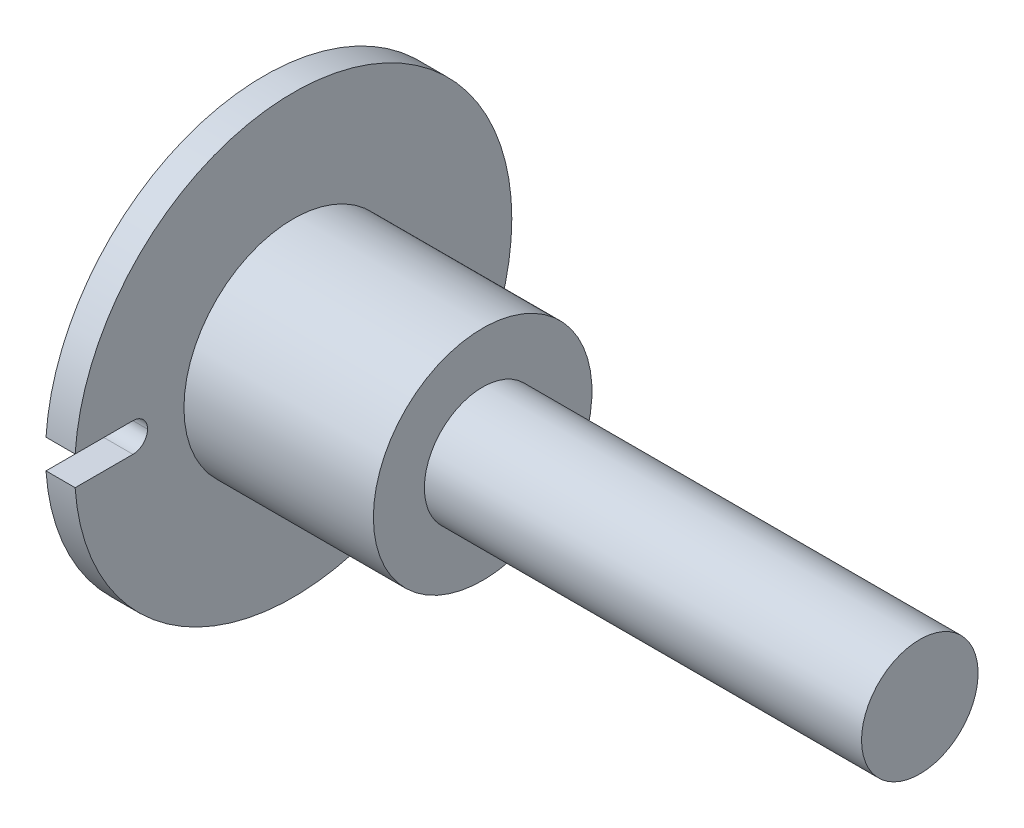
ISO-10303-21;
HEADER;
FILE_DESCRIPTION(('STEP AP214'),'2;1');
FILE_NAME('part.step','',(''),(''),'','','');
FILE_SCHEMA(('AUTOMOTIVE_DESIGN { 1 0 10303 214 1 1 1 1 }'));
ENDSEC;
DATA;
#1=APPLICATION_CONTEXT('core data for automotive mechanical design processes');
#2=APPLICATION_PROTOCOL_DEFINITION('international standard','automotive_design',2000,#1);
#3=PRODUCT_CONTEXT('',#1,'mechanical');
#4=PRODUCT('Part','Part','',(#3));
#5=PRODUCT_RELATED_PRODUCT_CATEGORY('part','',(#4));
#6=PRODUCT_DEFINITION_FORMATION('','',#4);
#7=PRODUCT_DEFINITION_CONTEXT('part definition',#1,'design');
#8=PRODUCT_DEFINITION('design','',#6,#7);
#9=PRODUCT_DEFINITION_SHAPE('','',#8);
#10=(LENGTH_UNIT() NAMED_UNIT(*) SI_UNIT(.MILLI.,.METRE.));
#11=(NAMED_UNIT(*) PLANE_ANGLE_UNIT() SI_UNIT($,.RADIAN.));
#12=(NAMED_UNIT(*) SI_UNIT($,.STERADIAN.) SOLID_ANGLE_UNIT());
#13=UNCERTAINTY_MEASURE_WITH_UNIT(LENGTH_MEASURE(1.E-05),#10,'distance_accuracy_value','');
#14=(GEOMETRIC_REPRESENTATION_CONTEXT(3) GLOBAL_UNCERTAINTY_ASSIGNED_CONTEXT((#13)) GLOBAL_UNIT_ASSIGNED_CONTEXT((#10,
#11,#12)) REPRESENTATION_CONTEXT('',''));
#15=CARTESIAN_POINT('',(0.,0.,0.));
#16=DIRECTION('',(0.,0.,1.));
#17=DIRECTION('',(1.,0.,0.));
#18=AXIS2_PLACEMENT_3D('',#15,#16,#17);
#19=CARTESIAN_POINT('',(0.,7.49999999999999,0.));
#20=DIRECTION('',(1.,0.,0.));
#21=DIRECTION('',(0.,0.,-1.));
#22=AXIS2_PLACEMENT_3D('',#19,#20,#21);
#23=PLANE('',#22);
#24=CARTESIAN_POINT('',(0.,0.,0.));
#25=DIRECTION('',(-1.,0.,0.));
#26=DIRECTION('',(0.,0.,1.));
#27=AXIS2_PLACEMENT_3D('',#24,#25,#26);
#28=CIRCLE('',#27,3.2);
#29=CARTESIAN_POINT('',(0.,0.,3.2));
#30=VERTEX_POINT('',#29);
#31=EDGE_CURVE('E350',#30,#30,#28,.T.);
#32=ORIENTED_EDGE('',*,*,#31,.F.);
#33=EDGE_LOOP('',(#32));
#34=FACE_BOUND('',#33,.T.);
#35=CARTESIAN_POINT('',(0.,0.,0.));
#36=DIRECTION('',(-1.,0.,0.));
#37=DIRECTION('',(0.,0.,1.));
#38=AXIS2_PLACEMENT_3D('',#35,#36,#37);
#39=CIRCLE('',#38,15.);
#40=CARTESIAN_POINT('',(0.,0.999999999999993,14.9666295470958));
#41=VERTEX_POINT('',#40);
#42=CARTESIAN_POINT('',(0.,-1.00000000000001,14.9666295470958));
#43=VERTEX_POINT('',#42);
#44=EDGE_CURVE('E115',#41,#43,#39,.T.);
#45=ORIENTED_EDGE('',*,*,#44,.T.);
#46=DIRECTION('',(0.,0.,1.));
#47=VECTOR('',#46,1.);
#48=CARTESIAN_POINT('',(0.,-1.00000000000001,15.8387925572259));
#49=LINE('',#48,#47);
#50=CARTESIAN_POINT('',(0.,-1.00000000000001,11.));
#51=VERTEX_POINT('',#50);
#52=EDGE_CURVE('E116',#51,#43,#49,.T.);
#53=ORIENTED_EDGE('',*,*,#52,.F.);
#54=CARTESIAN_POINT('',(0.,0.,11.));
#55=DIRECTION('',(1.,0.,0.));
#56=DIRECTION('',(0.,0.,-1.));
#57=AXIS2_PLACEMENT_3D('',#54,#55,#56);
#58=CIRCLE('',#57,1.);
#59=CARTESIAN_POINT('',(0.,0.,10.));
#60=VERTEX_POINT('',#59);
#61=EDGE_CURVE('E61',#51,#60,#58,.T.);
#62=ORIENTED_EDGE('',*,*,#61,.T.);
#63=CARTESIAN_POINT('',(0.,0.,11.));
#64=DIRECTION('',(1.,0.,0.));
#65=DIRECTION('',(0.,0.,-1.));
#66=AXIS2_PLACEMENT_3D('',#63,#64,#65);
#67=CIRCLE('',#66,1.);
#68=CARTESIAN_POINT('',(0.,0.999999999999993,11.));
#69=VERTEX_POINT('',#68);
#70=EDGE_CURVE('E48',#60,#69,#67,.T.);
#71=ORIENTED_EDGE('',*,*,#70,.T.);
#72=DIRECTION('',(0.,0.,-1.));
#73=VECTOR('',#72,1.);
#74=CARTESIAN_POINT('',(0.,0.999999999999993,15.8387925572259));
#75=LINE('',#74,#73);
#76=EDGE_CURVE('E104',#41,#69,#75,.T.);
#77=ORIENTED_EDGE('',*,*,#76,.F.);
#78=EDGE_LOOP('',(#45,#53,#62,#71,#77));
#79=FACE_BOUND('',#78,.T.);
#80=ADVANCED_FACE('F39',(#34,#79),#23,.F.);
#81=CARTESIAN_POINT('',(0.,0.,0.));
#82=DIRECTION('',(-1.,0.,0.));
#83=DIRECTION('',(0.,0.,1.));
#84=AXIS2_PLACEMENT_3D('',#81,#82,#83);
#85=CYLINDRICAL_SURFACE('',#84,15.);
#86=CARTESIAN_POINT('',(2.,0.,0.));
#87=DIRECTION('',(-1.,0.,0.));
#88=DIRECTION('',(0.,0.,1.));
#89=AXIS2_PLACEMENT_3D('',#86,#87,#88);
#90=CIRCLE('',#89,15.);
#91=CARTESIAN_POINT('',(2.,0.999999999999993,14.9666295470958));
#92=VERTEX_POINT('',#91);
#93=CARTESIAN_POINT('',(2.,-1.00000000000001,14.9666295470958));
#94=VERTEX_POINT('',#93);
#95=EDGE_CURVE('E122',#92,#94,#90,.T.);
#96=ORIENTED_EDGE('',*,*,#95,.T.);
#97=DIRECTION('',(-1.,0.,0.));
#98=VECTOR('',#97,1.);
#99=CARTESIAN_POINT('',(0.,-1.00000000000001,14.9666295470958));
#100=LINE('',#99,#98);
#101=EDGE_CURVE('E111',#94,#43,#100,.T.);
#102=ORIENTED_EDGE('',*,*,#101,.T.);
#103=ORIENTED_EDGE('',*,*,#44,.F.);
#104=DIRECTION('',(-1.,0.,0.));
#105=VECTOR('',#104,1.);
#106=CARTESIAN_POINT('',(0.,0.999999999999993,14.9666295470958));
#107=LINE('',#106,#105);
#108=EDGE_CURVE('E101',#41,#92,#107,.F.);
#109=ORIENTED_EDGE('',*,*,#108,.T.);
#110=EDGE_LOOP('',(#96,#102,#103,#109));
#111=FACE_BOUND('',#110,.T.);
#112=ADVANCED_FACE('F119',(#111),#85,.T.);
#113=CARTESIAN_POINT('',(2.,7.49999999999999,0.));
#114=DIRECTION('',(-1.,0.,0.));
#115=DIRECTION('',(0.,0.,1.));
#116=AXIS2_PLACEMENT_3D('',#113,#114,#115);
#117=PLANE('',#116);
#118=DIRECTION('',(0.,0.,-1.));
#119=VECTOR('',#118,1.);
#120=CARTESIAN_POINT('',(2.,0.999999999999991,0.));
#121=LINE('',#120,#119);
#122=CARTESIAN_POINT('',(2.,0.999999999999993,11.));
#123=VERTEX_POINT('',#122);
#124=EDGE_CURVE('E106',#92,#123,#121,.T.);
#125=ORIENTED_EDGE('',*,*,#124,.T.);
#126=CARTESIAN_POINT('',(2.,0.,11.));
#127=DIRECTION('',(-1.,0.,0.));
#128=DIRECTION('',(0.,0.,1.));
#129=AXIS2_PLACEMENT_3D('',#126,#127,#128);
#130=CIRCLE('',#129,1.);
#131=CARTESIAN_POINT('',(2.,0.,10.));
#132=VERTEX_POINT('',#131);
#133=EDGE_CURVE('E12',#123,#132,#130,.T.);
#134=ORIENTED_EDGE('',*,*,#133,.T.);
#135=CARTESIAN_POINT('',(2.,0.,11.));
#136=DIRECTION('',(-1.,0.,0.));
#137=DIRECTION('',(0.,0.,1.));
#138=AXIS2_PLACEMENT_3D('',#135,#136,#137);
#139=CIRCLE('',#138,1.);
#140=CARTESIAN_POINT('',(2.,-1.00000000000001,11.));
#141=VERTEX_POINT('',#140);
#142=EDGE_CURVE('E219',#132,#141,#139,.T.);
#143=ORIENTED_EDGE('',*,*,#142,.T.);
#144=DIRECTION('',(0.,0.,1.));
#145=VECTOR('',#144,1.);
#146=CARTESIAN_POINT('',(2.,-1.00000000000001,15.8387925572259));
#147=LINE('',#146,#145);
#148=EDGE_CURVE('E112',#141,#94,#147,.T.);
#149=ORIENTED_EDGE('',*,*,#148,.T.);
#150=ORIENTED_EDGE('',*,*,#95,.F.);
#151=EDGE_LOOP('',(#125,#134,#143,#149,#150));
#152=FACE_BOUND('',#151,.T.);
#153=CARTESIAN_POINT('',(2.,0.,0.));
#154=DIRECTION('',(-1.,0.,0.));
#155=DIRECTION('',(0.,0.,1.));
#156=AXIS2_PLACEMENT_3D('',#153,#154,#155);
#157=CIRCLE('',#156,7.49999999999999);
#158=CARTESIAN_POINT('',(2.,0.,7.49999999999999));
#159=VERTEX_POINT('',#158);
#160=EDGE_CURVE('E127',#159,#159,#157,.T.);
#161=ORIENTED_EDGE('',*,*,#160,.T.);
#162=EDGE_LOOP('',(#161));
#163=FACE_BOUND('',#162,.T.);
#164=ADVANCED_FACE('F197',(#152,#163),#117,.F.);
#165=CARTESIAN_POINT('',(0.,0.,0.));
#166=DIRECTION('',(-1.,0.,0.));
#167=DIRECTION('',(0.,0.,1.));
#168=AXIS2_PLACEMENT_3D('',#165,#166,#167);
#169=CYLINDRICAL_SURFACE('',#168,7.49999999999999);
#170=CARTESIAN_POINT('',(3.35000000000001,0.,-7.5));
#171=CARTESIAN_POINT('',(3.35000310611671,-0.0914999393408011,-7.49999831424107));
#172=CARTESIAN_POINT('',(3.35763681893135,-0.183037296855732,-7.49830854961463));
#173=CARTESIAN_POINT('',(3.38793774059132,-0.363511023320149,-7.49173097533342));
#174=CARTESIAN_POINT('',(3.41061560676644,-0.452445501715037,-7.48684089859969));
#175=CARTESIAN_POINT('',(3.4702594460308,-0.625079242768202,-7.47440705823353));
#176=CARTESIAN_POINT('',(3.5072104072657,-0.708783898837724,-7.46686608345357));
#177=CARTESIAN_POINT('',(3.59430369108382,-0.868802700314479,-7.4499439147352));
#178=CARTESIAN_POINT('',(3.64444570320342,-0.945117019602317,-7.44056276410836));
#179=CARTESIAN_POINT('',(3.75735851081085,-1.08942970934261,-7.42081741826452));
#180=CARTESIAN_POINT('',(3.82030233112952,-1.15729102940931,-7.41044091267737));
#181=CARTESIAN_POINT('',(3.95666059821246,-1.28158292851941,-7.38996090019821));
#182=CARTESIAN_POINT('',(4.03007598626926,-1.33801247885255,-7.37985741794559));
#183=CARTESIAN_POINT('',(4.18630865707019,-1.43844520787671,-7.36094592663126));
#184=CARTESIAN_POINT('',(4.2692219920339,-1.48230220287272,-7.35215368644802));
#185=CARTESIAN_POINT('',(4.4414672541749,-1.55540709540188,-7.33703697303093));
#186=CARTESIAN_POINT('',(4.53079840275644,-1.58465676165372,-7.33071220104563));
#187=CARTESIAN_POINT('',(4.71185604060336,-1.62726320761459,-7.32137195378109));
#188=CARTESIAN_POINT('',(4.80352273369726,-1.64086278535652,-7.31830597985858));
#189=CARTESIAN_POINT('',(4.98788393584833,-1.65253801366901,-7.31567882302511));
#190=CARTESIAN_POINT('',(5.08057831560923,-1.6506155954628,-7.31611720410753));
#191=CARTESIAN_POINT('',(5.26255651832943,-1.6314967280213,-7.32040352024314));
#192=CARTESIAN_POINT('',(5.35187171274146,-1.61458260643201,-7.32418842940723));
#193=CARTESIAN_POINT('',(5.52636491367246,-1.5664078726783,-7.33464165989446));
#194=CARTESIAN_POINT('',(5.61154268534622,-1.53514644719315,-7.34131014468066));
#195=CARTESIAN_POINT('',(5.77613543515266,-1.45890598688934,-7.35684109933612));
#196=CARTESIAN_POINT('',(5.85549854469096,-1.41381862824297,-7.36572078647475));
#197=CARTESIAN_POINT('',(6.00563681822603,-1.3112823169619,-7.38466310141159));
#198=CARTESIAN_POINT('',(6.07641079653823,-1.25383166066754,-7.39472589215442));
#199=CARTESIAN_POINT('',(6.20898696289339,-1.12670629880249,-7.4151708176593));
#200=CARTESIAN_POINT('',(6.27055890866493,-1.05679158832993,-7.42555512168706));
#201=CARTESIAN_POINT('',(6.38114162391205,-0.907510905058955,-7.44527255252899));
#202=CARTESIAN_POINT('',(6.43015216066825,-0.82814475719804,-7.45460565986633));
#203=CARTESIAN_POINT('',(6.51427876446434,-0.66193126789529,-7.47119996106589));
#204=CARTESIAN_POINT('',(6.54936438579448,-0.575068033653586,-7.47845660535503));
#205=CARTESIAN_POINT('',(6.60437741477181,-0.396483640858849,-7.49004657125318));
#206=CARTESIAN_POINT('',(6.62430705299566,-0.304763199289836,-7.49438032302728));
#207=CARTESIAN_POINT('',(6.64810686225331,-0.121042700683248,-7.49957488574713));
#208=CARTESIAN_POINT('',(6.65229150836261,-0.0290852501339726,-7.50050369388943));
#209=CARTESIAN_POINT('',(6.64533530497128,0.154214783533878,-7.49897438369855));
#210=CARTESIAN_POINT('',(6.6341955077154,0.245557408436373,-7.49651649791088));
#211=CARTESIAN_POINT('',(6.59716734867784,0.423991007748931,-7.48853291011624));
#212=CARTESIAN_POINT('',(6.57144418417209,0.511117938303425,-7.48304158779086));
#213=CARTESIAN_POINT('',(6.50616304243661,0.679820246095632,-7.46960587824171));
#214=CARTESIAN_POINT('',(6.4666038771267,0.76139514586854,-7.46166128036508));
#215=CARTESIAN_POINT('',(6.37412021678148,0.91797626178145,-7.44403270371492));
#216=CARTESIAN_POINT('',(6.3210113077241,0.992870859505147,-7.43432530594192));
#217=CARTESIAN_POINT('',(6.20317828981348,1.13279771208182,-7.41429527403409));
#218=CARTESIAN_POINT('',(6.13845265358407,1.19782866797858,-7.40397255911622));
#219=CARTESIAN_POINT('',(5.99777972140023,1.3174275998863,-7.38364007713335));
#220=CARTESIAN_POINT('',(5.9216455687045,1.37177769648958,-7.373639743821));
#221=CARTESIAN_POINT('',(5.76114557478182,1.46692164784539,-7.35530407569123));
#222=CARTESIAN_POINT('',(5.67678009126484,1.50771609134851,-7.34696866856883));
#223=CARTESIAN_POINT('',(5.50266583069711,1.57431369753847,-7.33298679212086));
#224=CARTESIAN_POINT('',(5.41295070372414,1.60020149826091,-7.32732517503716));
#225=CARTESIAN_POINT('',(5.23030301929308,1.63649815552641,-7.31930499643681));
#226=CARTESIAN_POINT('',(5.1373709857545,1.64690952060538,-7.31694589962669));
#227=CARTESIAN_POINT('',(4.95312503071481,1.65185003885159,-7.31583187657224));
#228=CARTESIAN_POINT('',(4.86182068005767,1.64672474541726,-7.3169985317166));
#229=CARTESIAN_POINT('',(4.68141088624511,1.62151064971411,-7.32262705863688));
#230=CARTESIAN_POINT('',(4.59230541656233,1.60142202805462,-7.32708889063958));
#231=CARTESIAN_POINT('',(4.41910112635546,1.54701934318005,-7.33876659051328));
#232=CARTESIAN_POINT('',(4.33498562625966,1.51275612845809,-7.34597260690616));
#233=CARTESIAN_POINT('',(4.17364583773919,1.4310203389896,-7.36233049430585));
#234=CARTESIAN_POINT('',(4.09642227803702,1.38354636957811,-7.37148257073496));
#235=CARTESIAN_POINT('',(3.94935629114057,1.27559296460683,-7.39093521541419));
#236=CARTESIAN_POINT('',(3.87969702034748,1.21486750796967,-7.40125543681466));
#237=CARTESIAN_POINT('',(3.7514440654572,1.08263275210779,-7.42175007997792));
#238=CARTESIAN_POINT('',(3.69285294474132,1.01112096165039,-7.43192446746263));
#239=CARTESIAN_POINT('',(3.58766084833745,0.858209468643988,-7.45113988726204));
#240=CARTESIAN_POINT('',(3.54122778138351,0.776692042971306,-7.46016424553825));
#241=CARTESIAN_POINT('',(3.46279610167867,0.606827789468279,-7.47589523887678));
#242=CARTESIAN_POINT('',(3.43078544962678,0.51848673019753,-7.48260380597825));
#243=CARTESIAN_POINT('',(3.38777623108907,0.358388456603653,-7.49175811514749));
#244=CARTESIAN_POINT('',(3.37363730619918,0.287493809384326,-7.49482960012879));
#245=CARTESIAN_POINT('',(3.35474817756303,0.144407171386656,-7.49895116200565));
#246=CARTESIAN_POINT('',(3.34999754853432,0.0722152395237924,-7.5000013304652));
#247=CARTESIAN_POINT('',(3.35000000000001,0.,-7.5));
#248=B_SPLINE_CURVE_WITH_KNOTS('',3,(#170,#171,#172,#173,#174,#175,#176,#177,#178,#179,#180,
#181,#182,#183,#184,#185,#186,#187,#188,#189,#190,#191,#192,#193,#194,#195,#196,#197,#198,#199,
#200,#201,#202,#203,#204,#205,#206,#207,#208,#209,#210,#211,#212,#213,#214,#215,#216,#217,#218,
#219,#220,#221,#222,#223,#224,#225,#226,#227,#228,#229,#230,#231,#232,#233,#234,#235,#236,#237,
#238,#239,#240,#241,#242,#243,#244,#245,#246,#247),.UNSPECIFIED.,.T.,.F.,(4,2,2,2,2,2,2,2,2,2,2,
2,2,2,2,2,2,2,2,2,2,2,2,2,2,2,2,2,2,2,2,2,2,2,2,2,2,2,4),(0.,0.274235469748509,
0.548665416592522,0.822807511778602,1.09694315535338,1.37506480293447,1.65321146673233,
1.93447194708655,2.21569836294015,2.49250033112996,2.76926786056845,3.04093142111883,
3.31261038365022,3.58647477653389,3.86037693206285,4.14027337309168,4.42017499925701,
4.70068528026745,4.98115426927861,5.25599076583745,5.53080839183635,5.80257342230781,
6.07436179463612,6.35006739343503,6.62580926880843,6.90669641720308,7.1875713644818,
7.46683540152298,7.74605416843228,8.01910869065847,8.29215991713439,8.56424000622432,
8.8363488298283,9.11402013989234,9.39175567994315,9.67314563039329,9.95430024968245,
10.1707471396203,10.3871842244587),.UNSPECIFIED.);
#249=CARTESIAN_POINT('',(3.35000000000001,0.,-7.5));
#250=VERTEX_POINT('',#249);
#251=EDGE_CURVE('E138',#250,#250,#248,.T.);
#252=ORIENTED_EDGE('',*,*,#251,.T.);
#253=EDGE_LOOP('',(#252));
#254=FACE_BOUND('',#253,.T.);
#255=ORIENTED_EDGE('',*,*,#160,.F.);
#256=EDGE_LOOP('',(#255));
#257=FACE_BOUND('',#256,.T.);
#258=CARTESIAN_POINT('',(15.,0.,0.));
#259=DIRECTION('',(-1.,0.,0.));
#260=DIRECTION('',(0.,0.,1.));
#261=AXIS2_PLACEMENT_3D('',#258,#259,#260);
#262=CIRCLE('',#261,7.49999999999999);
#263=CARTESIAN_POINT('',(15.,0.,7.49999999999999));
#264=VERTEX_POINT('',#263);
#265=EDGE_CURVE('E364',#264,#264,#262,.T.);
#266=ORIENTED_EDGE('',*,*,#265,.T.);
#267=EDGE_LOOP('',(#266));
#268=FACE_BOUND('',#267,.T.);
#269=ADVANCED_FACE('F146',(#254,#257,#268),#169,.T.);
#270=CARTESIAN_POINT('',(15.,7.49999999999999,0.));
#271=DIRECTION('',(-1.,0.,0.));
#272=DIRECTION('',(0.,0.,1.));
#273=AXIS2_PLACEMENT_3D('',#270,#271,#272);
#274=PLANE('',#273);
#275=ORIENTED_EDGE('',*,*,#265,.F.);
#276=EDGE_LOOP('',(#275));
#277=FACE_BOUND('',#276,.T.);
#278=CARTESIAN_POINT('',(15.,0.,0.));
#279=DIRECTION('',(-1.,0.,0.));
#280=DIRECTION('',(0.,0.,1.));
#281=AXIS2_PLACEMENT_3D('',#278,#279,#280);
#282=CIRCLE('',#281,4.);
#283=CARTESIAN_POINT('',(15.,0.,4.));
#284=VERTEX_POINT('',#283);
#285=EDGE_CURVE('E361',#284,#284,#282,.T.);
#286=ORIENTED_EDGE('',*,*,#285,.T.);
#287=EDGE_LOOP('',(#286));
#288=FACE_BOUND('',#287,.T.);
#289=ADVANCED_FACE('F190',(#277,#288),#274,.F.);
#290=CARTESIAN_POINT('',(0.,0.,0.));
#291=DIRECTION('',(-1.,0.,0.));
#292=DIRECTION('',(0.,0.,1.));
#293=AXIS2_PLACEMENT_3D('',#290,#291,#292);
#294=CYLINDRICAL_SURFACE('',#293,4.);
#295=CARTESIAN_POINT('',(35.,0.,0.));
#296=DIRECTION('',(1.,0.,0.));
#297=DIRECTION('',(0.,0.,-1.));
#298=AXIS2_PLACEMENT_3D('',#295,#296,#297);
#299=CIRCLE('',#298,4.);
#300=CARTESIAN_POINT('',(35.,-1.93649167310372,-3.49999999999999));
#301=VERTEX_POINT('',#300);
#302=CARTESIAN_POINT('',(35.,1.93649167310372,-3.49999999999999));
#303=VERTEX_POINT('',#302);
#304=EDGE_CURVE('E125',#301,#303,#299,.T.);
#305=ORIENTED_EDGE('',*,*,#304,.T.);
#306=DIRECTION('',(-1.,0.,0.));
#307=VECTOR('',#306,1.);
#308=CARTESIAN_POINT('',(0.,1.93649167310372,-3.49999999999999));
#309=LINE('',#308,#307);
#310=CARTESIAN_POINT('',(29.,1.93649167310372,-3.49999999999999));
#311=VERTEX_POINT('',#310);
#312=EDGE_CURVE('E135',#303,#311,#309,.T.);
#313=ORIENTED_EDGE('',*,*,#312,.T.);
#314=CARTESIAN_POINT('',(29.,0.,0.));
#315=DIRECTION('',(-1.,0.,0.));
#316=DIRECTION('',(0.,0.,1.));
#317=AXIS2_PLACEMENT_3D('',#314,#315,#316);
#318=CIRCLE('',#317,4.);
#319=CARTESIAN_POINT('',(29.,-1.93649167310372,-3.49999999999999));
#320=VERTEX_POINT('',#319);
#321=EDGE_CURVE('E132',#311,#320,#318,.T.);
#322=ORIENTED_EDGE('',*,*,#321,.T.);
#323=DIRECTION('',(-1.,0.,0.));
#324=VECTOR('',#323,1.);
#325=CARTESIAN_POINT('',(0.,-1.93649167310372,-3.49999999999999));
#326=LINE('',#325,#324);
#327=EDGE_CURVE('E121',#320,#301,#326,.F.);
#328=ORIENTED_EDGE('',*,*,#327,.T.);
#329=EDGE_LOOP('',(#305,#313,#322,#328));
#330=FACE_BOUND('',#329,.T.);
#331=ORIENTED_EDGE('',*,*,#285,.F.);
#332=EDGE_LOOP('',(#331));
#333=FACE_BOUND('',#332,.T.);
#334=CARTESIAN_POINT('',(45.,0.,0.));
#335=DIRECTION('',(-1.,0.,0.));
#336=DIRECTION('',(0.,0.,1.));
#337=AXIS2_PLACEMENT_3D('',#334,#335,#336);
#338=CIRCLE('',#337,4.);
#339=CARTESIAN_POINT('',(45.,0.,4.));
#340=VERTEX_POINT('',#339);
#341=EDGE_CURVE('E356',#340,#340,#338,.T.);
#342=ORIENTED_EDGE('',*,*,#341,.T.);
#343=EDGE_LOOP('',(#342));
#344=FACE_BOUND('',#343,.T.);
#345=ADVANCED_FACE('F187',(#330,#333,#344),#294,.T.);
#346=CARTESIAN_POINT('',(45.,4.,0.));
#347=DIRECTION('',(-1.,0.,0.));
#348=DIRECTION('',(0.,0.,1.));
#349=AXIS2_PLACEMENT_3D('',#346,#347,#348);
#350=PLANE('',#349);
#351=ORIENTED_EDGE('',*,*,#341,.F.);
#352=EDGE_LOOP('',(#351));
#353=FACE_BOUND('',#352,.T.);
#354=ADVANCED_FACE('F183',(#353),#350,.F.);
#355=CARTESIAN_POINT('',(10.,0.,0.));
#356=DIRECTION('',(-1.,0.,0.));
#357=DIRECTION('',(0.,0.,1.));
#358=AXIS2_PLACEMENT_3D('',#355,#356,#357);
#359=CONICAL_SURFACE('',#358,3.2,1.02974425867666);
#360=CARTESIAN_POINT('',(11.9227539808882,0.,0.));
#361=VERTEX_POINT('',#360);
#362=VERTEX_LOOP('',#361);
#363=FACE_BOUND('',#362,.T.);
#364=CARTESIAN_POINT('',(10.,0.,0.));
#365=DIRECTION('',(-1.,0.,0.));
#366=DIRECTION('',(0.,0.,1.));
#367=AXIS2_PLACEMENT_3D('',#364,#365,#366);
#368=CIRCLE('',#367,3.2);
#369=CARTESIAN_POINT('',(10.,0.,3.2));
#370=VERTEX_POINT('',#369);
#371=EDGE_CURVE('E352',#370,#370,#368,.T.);
#372=ORIENTED_EDGE('',*,*,#371,.T.);
#373=EDGE_LOOP('',(#372));
#374=FACE_BOUND('',#373,.T.);
#375=ADVANCED_FACE('F179',(#363,#374),#359,.F.);
#376=CARTESIAN_POINT('',(0.,0.,0.));
#377=DIRECTION('',(-1.,0.,0.));
#378=DIRECTION('',(0.,0.,1.));
#379=AXIS2_PLACEMENT_3D('',#376,#377,#378);
#380=CYLINDRICAL_SURFACE('',#379,3.2);
#381=CARTESIAN_POINT('',(3.35000000000001,0.,-3.2));
#382=CARTESIAN_POINT('',(3.35000559244192,0.0864152707853275,-3.19999508077442));
#383=CARTESIAN_POINT('',(3.35682847236779,0.172923664702105,-3.19646256806704));
#384=CARTESIAN_POINT('',(3.38380836249913,0.343362919894731,-3.18267908772859));
#385=CARTESIAN_POINT('',(3.40398855325373,0.427289034390029,-3.17241644077198));
#386=CARTESIAN_POINT('',(3.45667332287795,0.589842351504588,-3.14624194800086));
#387=CARTESIAN_POINT('',(3.48912903946685,0.668489125628825,-3.13035251517629));
#388=CARTESIAN_POINT('',(3.56517927629042,0.819092973211068,-3.09436430560885));
#389=CARTESIAN_POINT('',(3.60877336420755,0.891050306160918,-3.07426569224384));
#390=CARTESIAN_POINT('',(3.70898283459263,1.03134303203517,-3.03019367084879));
#391=CARTESIAN_POINT('',(3.76624665880042,1.09916274453588,-3.00605572181126));
#392=CARTESIAN_POINT('',(3.89076596314732,1.22471551377196,-2.95713049491589));
#393=CARTESIAN_POINT('',(3.9580294977144,1.28244035709955,-2.93234270701522));
#394=CARTESIAN_POINT('',(4.10738277217583,1.39102647595891,-2.88251741139938));
#395=CARTESIAN_POINT('',(4.19024255328784,1.44090740444982,-2.85763300325055));
#396=CARTESIAN_POINT('',(4.36457799652441,1.5258174535166,-2.81321733921836));
#397=CARTESIAN_POINT('',(4.45604717911169,1.56085763588829,-2.79368210009622));
#398=CARTESIAN_POINT('',(4.63932434268172,1.61273411294198,-2.76404381312061));
#399=CARTESIAN_POINT('',(4.73076771354771,1.63055479100545,-2.75343590078242));
#400=CARTESIAN_POINT('',(4.91590921508332,1.6504759700671,-2.74154700259795));
#401=CARTESIAN_POINT('',(5.00960473328056,1.65259387950201,-2.74025568820781));
#402=CARTESIAN_POINT('',(5.1835545791483,1.6417693550478,-2.74674507623449));
#403=CARTESIAN_POINT('',(5.26398164430395,1.63073714672542,-2.75337536035727));
#404=CARTESIAN_POINT('',(5.42162578438611,1.59725641823095,-2.7729305991337));
#405=CARTESIAN_POINT('',(5.49884171084826,1.57480385091169,-2.78585778521484));
#406=CARTESIAN_POINT('',(5.65007564803456,1.5187366073385,-2.81682082205625));
#407=CARTESIAN_POINT('',(5.72397888907858,1.48487652456566,-2.8349675811318));
#408=CARTESIAN_POINT('',(5.86541935565677,1.4071492750333,-2.87433944978283));
#409=CARTESIAN_POINT('',(5.93295370408361,1.36327761592095,-2.89556593972028));
#410=CARTESIAN_POINT('',(6.06940750490147,1.2598251254682,-2.9421889908064));
#411=CARTESIAN_POINT('',(6.13726642453518,1.19891934325653,-2.9677600961565));
#412=CARTESIAN_POINT('',(6.26226538506839,1.06652699210508,-3.0178687688044));
#413=CARTESIAN_POINT('',(6.31939966599494,0.995034774079372,-3.04240577525532));
#414=CARTESIAN_POINT('',(6.42415781059045,0.838790326194906,-3.08924177676399));
#415=CARTESIAN_POINT('',(6.47112826648288,0.753540248957151,-3.11135669048004));
#416=CARTESIAN_POINT('',(6.54966411387064,0.574922557582704,-3.14924924001514));
#417=CARTESIAN_POINT('',(6.58124245362318,0.481561844507558,-3.16503220045701));
#418=CARTESIAN_POINT('',(6.62536950120158,0.29799682406234,-3.18731829346232));
#419=CARTESIAN_POINT('',(6.63932412582626,0.208214339526598,-3.19450417108732));
#420=CARTESIAN_POINT('',(6.65226038389701,0.0273093898624063,-3.20116065669458));
#421=CARTESIAN_POINT('',(6.65124980530661,-0.0638123536449451,-3.20063527765307));
#422=CARTESIAN_POINT('',(6.63504729842414,-0.236698383408092,-3.19230982571868));
#423=CARTESIAN_POINT('',(6.62104730376562,-0.318608389332692,-3.18512123502663));
#424=CARTESIAN_POINT('',(6.58117711173421,-0.478736450310469,-3.16501586646095));
#425=CARTESIAN_POINT('',(6.55530564140775,-0.556954108448687,-3.15209847430487));
#426=CARTESIAN_POINT('',(6.49181686225892,-0.709951401365002,-3.12125430386066));
#427=CARTESIAN_POINT('',(6.45390038307285,-0.784580526957245,-3.10320131685999));
#428=CARTESIAN_POINT('',(6.36774591255743,-0.926650663863897,-3.0637823720122));
#429=CARTESIAN_POINT('',(6.31950367082497,-0.994088697924275,-3.04241505088289));
#430=CARTESIAN_POINT('',(6.20836202964627,-1.12722383291821,-2.99580325752229));
#431=CARTESIAN_POINT('',(6.14446577579745,-1.19202957183323,-2.97038601132887));
#432=CARTESIAN_POINT('',(6.00674413914418,-1.31042840252269,-2.92008970102943));
#433=CARTESIAN_POINT('',(5.93291088279366,-1.36401251594083,-2.89521108203618));
#434=CARTESIAN_POINT('',(5.7721624152751,-1.46136382637135,-2.84737178120177));
#435=CARTESIAN_POINT('',(5.68474165548241,-1.50439817794128,-2.82460100956461));
#436=CARTESIAN_POINT('',(5.50236501105159,-1.57468899833004,-2.78603372385417));
#437=CARTESIAN_POINT('',(5.40741958255871,-1.60196693951992,-2.77022772539748));
#438=CARTESIAN_POINT('',(5.22255139176454,-1.63735856392613,-2.74944378652585));
#439=CARTESIAN_POINT('',(5.13304133421543,-1.64708128687728,-2.74356045825142));
#440=CARTESIAN_POINT('',(4.95351267798822,-1.65178342923619,-2.740734535413));
#441=CARTESIAN_POINT('',(4.8634943771128,-1.64677073628677,-2.74378715756771));
#442=CARTESIAN_POINT('',(4.69571188799856,-1.62367095678265,-2.75750521866387));
#443=CARTESIAN_POINT('',(4.61766789225213,-1.60704175849219,-2.76732023819288));
#444=CARTESIAN_POINT('',(4.46558934447731,-1.56306592237236,-2.79239353945217));
#445=CARTESIAN_POINT('',(4.39155616754317,-1.53571563499492,-2.80765367458628));
#446=CARTESIAN_POINT('',(4.24413323747551,-1.46906125224864,-2.84312688037048));
#447=CARTESIAN_POINT('',(4.17111288543556,-1.42908379715373,-2.86360161958269));
#448=CARTESIAN_POINT('',(4.0323317081746,-1.33901820226098,-2.90680662594666));
#449=CARTESIAN_POINT('',(3.96657478789225,-1.28892466442653,-2.9295380940038));
#450=CARTESIAN_POINT('',(3.83513761898474,-1.1723046148549,-2.97828809454274));
#451=CARTESIAN_POINT('',(3.77061544276832,-1.10448137597883,-3.0043441032997));
#452=CARTESIAN_POINT('',(3.65356535046498,-0.958321428834773,-3.05410822403694));
#453=CARTESIAN_POINT('',(3.60104444102548,-0.879978621127954,-3.07781495990113));
#454=CARTESIAN_POINT('',(3.50902956981541,-0.713234990227862,-3.12070678668179));
#455=CARTESIAN_POINT('',(3.46973531417022,-0.624704918957628,-3.1398214107226));
#456=CARTESIAN_POINT('',(3.40711869663277,-0.441109036090594,-3.17080779117295));
#457=CARTESIAN_POINT('',(3.38375213653399,-0.346062122674846,-3.18269958034155));
#458=CARTESIAN_POINT('',(3.36266708873441,-0.208301132061124,-3.19348366405149));
#459=CARTESIAN_POINT('',(3.35792461582284,-0.166828920116874,-3.19592000467562));
#460=CARTESIAN_POINT('',(3.35158967981078,-0.0835784067253104,-3.19917938240878));
#461=CARTESIAN_POINT('',(3.34999729486912,-0.0418000977090393,-3.20000237948811));
#462=CARTESIAN_POINT('',(3.35000000000001,0.,-3.2));
#463=B_SPLINE_CURVE_WITH_KNOTS('',3,(#381,#382,#383,#384,#385,#386,#387,#388,#389,#390,#391,
#392,#393,#394,#395,#396,#397,#398,#399,#400,#401,#402,#403,#404,#405,#406,#407,#408,#409,#410,
#411,#412,#413,#414,#415,#416,#417,#418,#419,#420,#421,#422,#423,#424,#425,#426,#427,#428,#429,
#430,#431,#432,#433,#434,#435,#436,#437,#438,#439,#440,#441,#442,#443,#444,#445,#446,#447,#448,
#449,#450,#451,#452,#453,#454,#455,#456,#457,#458,#459,#460,#461,#462),.UNSPECIFIED.,.T.,.F.,(4,
2,2,2,2,2,2,2,2,2,2,2,2,2,2,2,2,2,2,2,2,2,2,2,2,2,2,2,2,2,2,2,2,2,2,2,2,2,2,2,4),(0.,
0.25907667746465,0.518604144832863,0.777109262702292,1.03560434864484,1.31042329033498,
1.58546480087173,1.88355164353053,2.18141590953442,2.46101777185641,2.74030961495351,
2.98352113349438,3.22681890145291,3.47572586049423,3.72474472841249,4.00762710653065,
4.29066098268885,4.58849267116819,4.88607338144672,5.15799817714592,5.42978146685245,
5.67885674341566,5.92795873404448,6.18380797879314,6.43976274223736,6.7220250584934,
7.00451235555903,7.30308699480907,7.60125377951124,7.87035284505589,8.13930789221945,
8.37945551436324,8.61968495584885,8.87587178735312,9.13219568550025,9.42238671032932,
9.71274672570268,10.0073124283106,10.3010573679415,10.4263727392625,10.5516912198244),.UNSPECIFIED.);
#464=CARTESIAN_POINT('',(3.35000000000001,0.,-3.2));
#465=VERTEX_POINT('',#464);
#466=EDGE_CURVE('E163',#465,#465,#463,.T.);
#467=ORIENTED_EDGE('',*,*,#466,.T.);
#468=EDGE_LOOP('',(#467));
#469=FACE_BOUND('',#468,.T.);
#470=ORIENTED_EDGE('',*,*,#371,.F.);
#471=EDGE_LOOP('',(#470));
#472=FACE_BOUND('',#471,.T.);
#473=ORIENTED_EDGE('',*,*,#31,.T.);
#474=EDGE_LOOP('',(#473));
#475=FACE_BOUND('',#474,.T.);
#476=ADVANCED_FACE('F173',(#469,#472,#475),#380,.F.);
#477=CARTESIAN_POINT('',(29.,-15.,-4.));
#478=DIRECTION('',(-1.,0.,0.));
#479=DIRECTION('',(0.,0.,1.));
#480=AXIS2_PLACEMENT_3D('',#477,#478,#479);
#481=PLANE('',#480);
#482=DIRECTION('',(0.,1.,0.));
#483=VECTOR('',#482,1.);
#484=CARTESIAN_POINT('',(29.,-15.,-3.49999999999999));
#485=LINE('',#484,#483);
#486=EDGE_CURVE('E170',#320,#311,#485,.T.);
#487=ORIENTED_EDGE('',*,*,#486,.F.);
#488=ORIENTED_EDGE('',*,*,#321,.F.);
#489=EDGE_LOOP('',(#487,#488));
#490=FACE_BOUND('',#489,.T.);
#491=ADVANCED_FACE('F178',(#490),#481,.F.);
#492=CARTESIAN_POINT('',(35.,-15.,-4.));
#493=DIRECTION('',(1.,0.,0.));
#494=DIRECTION('',(0.,0.,-1.));
#495=AXIS2_PLACEMENT_3D('',#492,#493,#494);
#496=PLANE('',#495);
#497=ORIENTED_EDGE('',*,*,#304,.F.);
#498=DIRECTION('',(0.,1.,0.));
#499=VECTOR('',#498,1.);
#500=CARTESIAN_POINT('',(35.,-15.,-3.49999999999999));
#501=LINE('',#500,#499);
#502=EDGE_CURVE('E171',#301,#303,#501,.T.);
#503=ORIENTED_EDGE('',*,*,#502,.T.);
#504=EDGE_LOOP('',(#497,#503));
#505=FACE_BOUND('',#504,.T.);
#506=ADVANCED_FACE('F159',(#505),#496,.F.);
#507=CARTESIAN_POINT('',(29.,-15.,-3.49999999999999));
#508=DIRECTION('',(0.,0.,1.));
#509=DIRECTION('',(1.,0.,0.));
#510=AXIS2_PLACEMENT_3D('',#507,#508,#509);
#511=PLANE('',#510);
#512=ORIENTED_EDGE('',*,*,#502,.F.);
#513=ORIENTED_EDGE('',*,*,#327,.F.);
#514=ORIENTED_EDGE('',*,*,#486,.T.);
#515=ORIENTED_EDGE('',*,*,#312,.F.);
#516=EDGE_LOOP('',(#512,#513,#514,#515));
#517=FACE_BOUND('',#516,.T.);
#518=ADVANCED_FACE('F156',(#517),#511,.F.);
#519=CARTESIAN_POINT('',(5.,0.,-7.5));
#520=DIRECTION('',(0.,0.,-1.));
#521=DIRECTION('',(-1.,0.,0.));
#522=AXIS2_PLACEMENT_3D('',#519,#520,#521);
#523=CYLINDRICAL_SURFACE('',#522,1.64999999999999);
#524=ORIENTED_EDGE('',*,*,#251,.F.);
#525=EDGE_LOOP('',(#524));
#526=FACE_BOUND('',#525,.T.);
#527=ORIENTED_EDGE('',*,*,#466,.F.);
#528=EDGE_LOOP('',(#527));
#529=FACE_BOUND('',#528,.T.);
#530=ADVANCED_FACE('F150',(#526,#529),#523,.F.);
#531=CARTESIAN_POINT('',(2.,-1.00000000000001,15.8387925572259));
#532=DIRECTION('',(0.,-1.,0.));
#533=DIRECTION('',(0.,0.,-1.));
#534=AXIS2_PLACEMENT_3D('',#531,#532,#533);
#535=PLANE('',#534);
#536=ORIENTED_EDGE('',*,*,#148,.F.);
#537=DIRECTION('',(-1.,0.,0.));
#538=VECTOR('',#537,1.);
#539=CARTESIAN_POINT('',(0.,-1.00000000000001,11.));
#540=LINE('',#539,#538);
#541=EDGE_CURVE('E221',#141,#51,#540,.T.);
#542=ORIENTED_EDGE('',*,*,#541,.T.);
#543=ORIENTED_EDGE('',*,*,#52,.T.);
#544=ORIENTED_EDGE('',*,*,#101,.F.);
#545=EDGE_LOOP('',(#536,#542,#543,#544));
#546=FACE_BOUND('',#545,.T.);
#547=ADVANCED_FACE('F155',(#546),#535,.F.);
#548=CARTESIAN_POINT('',(2.,0.999999999999993,15.8387925572259));
#549=DIRECTION('',(0.,1.,0.));
#550=DIRECTION('',(0.,0.,1.));
#551=AXIS2_PLACEMENT_3D('',#548,#549,#550);
#552=PLANE('',#551);
#553=ORIENTED_EDGE('',*,*,#76,.T.);
#554=DIRECTION('',(-1.,0.,0.));
#555=VECTOR('',#554,1.);
#556=CARTESIAN_POINT('',(2.,0.999999999999993,11.));
#557=LINE('',#556,#555);
#558=EDGE_CURVE('E225',#69,#123,#557,.F.);
#559=ORIENTED_EDGE('',*,*,#558,.T.);
#560=ORIENTED_EDGE('',*,*,#124,.F.);
#561=ORIENTED_EDGE('',*,*,#108,.F.);
#562=EDGE_LOOP('',(#553,#559,#560,#561));
#563=FACE_BOUND('',#562,.T.);
#564=ADVANCED_FACE('F103',(#563),#552,.F.);
#565=CARTESIAN_POINT('',(2.,0.,11.));
#566=DIRECTION('',(1.,0.,0.));
#567=DIRECTION('',(0.,0.,-1.));
#568=AXIS2_PLACEMENT_3D('',#565,#566,#567);
#569=CYLINDRICAL_SURFACE('',#568,1.);
#570=DIRECTION('',(-1.,0.,0.));
#571=VECTOR('',#570,1.);
#572=CARTESIAN_POINT('',(0.,0.,10.));
#573=LINE('',#572,#571);
#574=EDGE_CURVE('E43',#132,#60,#573,.T.);
#575=ORIENTED_EDGE('',*,*,#574,.F.);
#576=ORIENTED_EDGE('',*,*,#133,.F.);
#577=ORIENTED_EDGE('',*,*,#558,.F.);
#578=ORIENTED_EDGE('',*,*,#70,.F.);
#579=EDGE_LOOP('',(#575,#576,#577,#578));
#580=FACE_BOUND('',#579,.T.);
#581=ADVANCED_FACE('F41',(#580),#569,.F.);
#582=CARTESIAN_POINT('',(2.,0.,11.));
#583=DIRECTION('',(1.,0.,0.));
#584=DIRECTION('',(0.,0.,-1.));
#585=AXIS2_PLACEMENT_3D('',#582,#583,#584);
#586=CYLINDRICAL_SURFACE('',#585,1.);
#587=ORIENTED_EDGE('',*,*,#142,.F.);
#588=ORIENTED_EDGE('',*,*,#574,.T.);
#589=ORIENTED_EDGE('',*,*,#61,.F.);
#590=ORIENTED_EDGE('',*,*,#541,.F.);
#591=EDGE_LOOP('',(#587,#588,#589,#590));
#592=FACE_BOUND('',#591,.T.);
#593=ADVANCED_FACE('F209',(#592),#586,.F.);
#594=CLOSED_SHELL('',(#80,#112,#164,#269,#289,#345,#354,#375,#476,#491,#506,#518,#530,#547,#564,
#581,#593));
#595=MANIFOLD_SOLID_BREP('B2',#594);
#596=ADVANCED_BREP_SHAPE_REPRESENTATION('',(#18,#595),#14);
#597=SHAPE_DEFINITION_REPRESENTATION(#9,#596);
ENDSEC;
END-ISO-10303-21;
